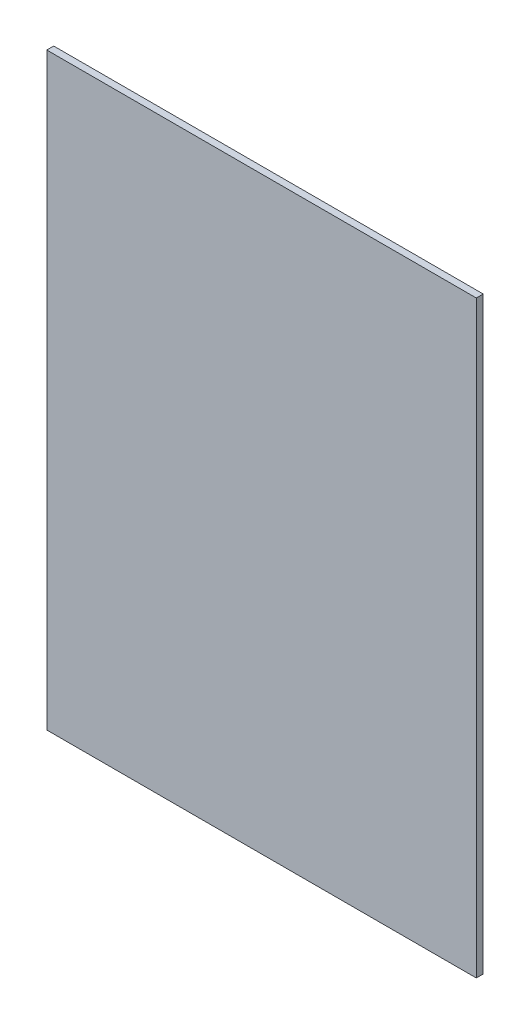
ISO-10303-21;
HEADER;
FILE_DESCRIPTION(('STEP AP214'),'2;1');
FILE_NAME('part.step','',(''),(''),'','','');
FILE_SCHEMA(('AUTOMOTIVE_DESIGN { 1 0 10303 214 1 1 1 1 }'));
ENDSEC;
DATA;
#1=APPLICATION_CONTEXT('core data for automotive mechanical design processes');
#2=APPLICATION_PROTOCOL_DEFINITION('international standard','automotive_design',2000,#1);
#3=PRODUCT_CONTEXT('',#1,'mechanical');
#4=PRODUCT('Part','Part','',(#3));
#5=PRODUCT_RELATED_PRODUCT_CATEGORY('part','',(#4));
#6=PRODUCT_DEFINITION_FORMATION('','',#4);
#7=PRODUCT_DEFINITION_CONTEXT('part definition',#1,'design');
#8=PRODUCT_DEFINITION('design','',#6,#7);
#9=PRODUCT_DEFINITION_SHAPE('','',#8);
#10=(LENGTH_UNIT() NAMED_UNIT(*) SI_UNIT(.MILLI.,.METRE.));
#11=(NAMED_UNIT(*) PLANE_ANGLE_UNIT() SI_UNIT($,.RADIAN.));
#12=(NAMED_UNIT(*) SI_UNIT($,.STERADIAN.) SOLID_ANGLE_UNIT());
#13=UNCERTAINTY_MEASURE_WITH_UNIT(LENGTH_MEASURE(1.E-05),#10,'distance_accuracy_value','');
#14=(GEOMETRIC_REPRESENTATION_CONTEXT(3) GLOBAL_UNCERTAINTY_ASSIGNED_CONTEXT((#13)) GLOBAL_UNIT_ASSIGNED_CONTEXT((#10,
#11,#12)) REPRESENTATION_CONTEXT('',''));
#15=CARTESIAN_POINT('',(0.,0.,0.));
#16=DIRECTION('',(0.,0.,1.));
#17=DIRECTION('',(1.,0.,0.));
#18=AXIS2_PLACEMENT_3D('',#15,#16,#17);
#19=CARTESIAN_POINT('',(-155.,-212.5,5.));
#20=DIRECTION('',(1.,0.,0.));
#21=DIRECTION('',(0.,0.,-1.));
#22=AXIS2_PLACEMENT_3D('',#19,#20,#21);
#23=PLANE('',#22);
#24=DIRECTION('',(0.,-1.,0.));
#25=VECTOR('',#24,1.);
#26=CARTESIAN_POINT('',(-155.,-212.5,0.));
#27=LINE('',#26,#25);
#28=CARTESIAN_POINT('',(-155.,212.5,0.));
#29=VERTEX_POINT('',#28);
#30=CARTESIAN_POINT('',(-155.,-212.5,0.));
#31=VERTEX_POINT('',#30);
#32=EDGE_CURVE('E96',#29,#31,#27,.T.);
#33=ORIENTED_EDGE('',*,*,#32,.T.);
#34=DIRECTION('',(0.,0.,-1.));
#35=VECTOR('',#34,1.);
#36=CARTESIAN_POINT('',(-155.,-212.5,5.));
#37=LINE('',#36,#35);
#38=CARTESIAN_POINT('',(-155.,-212.5,5.));
#39=VERTEX_POINT('',#38);
#40=EDGE_CURVE('E11',#39,#31,#37,.T.);
#41=ORIENTED_EDGE('',*,*,#40,.F.);
#42=DIRECTION('',(0.,-1.,0.));
#43=VECTOR('',#42,1.);
#44=CARTESIAN_POINT('',(-155.,-212.5,5.));
#45=LINE('',#44,#43);
#46=CARTESIAN_POINT('',(-155.,212.5,5.));
#47=VERTEX_POINT('',#46);
#48=EDGE_CURVE('E84',#47,#39,#45,.T.);
#49=ORIENTED_EDGE('',*,*,#48,.F.);
#50=DIRECTION('',(0.,0.,-1.));
#51=VECTOR('',#50,1.);
#52=CARTESIAN_POINT('',(-155.,212.5,5.));
#53=LINE('',#52,#51);
#54=EDGE_CURVE('E92',#47,#29,#53,.T.);
#55=ORIENTED_EDGE('',*,*,#54,.T.);
#56=EDGE_LOOP('',(#33,#41,#49,#55));
#57=FACE_BOUND('',#56,.T.);
#58=ADVANCED_FACE('F33',(#57),#23,.F.);
#59=CARTESIAN_POINT('',(155.,-212.5,5.));
#60=DIRECTION('',(0.,1.,0.));
#61=DIRECTION('',(-1.,0.,0.));
#62=AXIS2_PLACEMENT_3D('',#59,#60,#61);
#63=PLANE('',#62);
#64=DIRECTION('',(1.,0.,0.));
#65=VECTOR('',#64,1.);
#66=CARTESIAN_POINT('',(155.,-212.5,0.));
#67=LINE('',#66,#65);
#68=CARTESIAN_POINT('',(155.,-212.5,0.));
#69=VERTEX_POINT('',#68);
#70=EDGE_CURVE('E88',#31,#69,#67,.T.);
#71=ORIENTED_EDGE('',*,*,#70,.T.);
#72=DIRECTION('',(0.,0.,-1.));
#73=VECTOR('',#72,1.);
#74=CARTESIAN_POINT('',(155.,-212.5,5.));
#75=LINE('',#74,#73);
#76=CARTESIAN_POINT('',(155.,-212.5,5.));
#77=VERTEX_POINT('',#76);
#78=EDGE_CURVE('E41',#77,#69,#75,.T.);
#79=ORIENTED_EDGE('',*,*,#78,.F.);
#80=DIRECTION('',(1.,0.,0.));
#81=VECTOR('',#80,1.);
#82=CARTESIAN_POINT('',(155.,-212.5,5.));
#83=LINE('',#82,#81);
#84=EDGE_CURVE('E79',#39,#77,#83,.T.);
#85=ORIENTED_EDGE('',*,*,#84,.F.);
#86=ORIENTED_EDGE('',*,*,#40,.T.);
#87=EDGE_LOOP('',(#71,#79,#85,#86));
#88=FACE_BOUND('',#87,.T.);
#89=ADVANCED_FACE('F87',(#88),#63,.F.);
#90=CARTESIAN_POINT('',(155.,-212.5,5.));
#91=DIRECTION('',(-1.,0.,0.));
#92=DIRECTION('',(0.,0.,1.));
#93=AXIS2_PLACEMENT_3D('',#90,#91,#92);
#94=PLANE('',#93);
#95=DIRECTION('',(0.,1.,0.));
#96=VECTOR('',#95,1.);
#97=CARTESIAN_POINT('',(155.,-212.5,0.));
#98=LINE('',#97,#96);
#99=CARTESIAN_POINT('',(155.,212.5,0.));
#100=VERTEX_POINT('',#99);
#101=EDGE_CURVE('E66',#69,#100,#98,.T.);
#102=ORIENTED_EDGE('',*,*,#101,.T.);
#103=DIRECTION('',(0.,0.,-1.));
#104=VECTOR('',#103,1.);
#105=CARTESIAN_POINT('',(155.,212.5,5.));
#106=LINE('',#105,#104);
#107=CARTESIAN_POINT('',(155.,212.5,5.));
#108=VERTEX_POINT('',#107);
#109=EDGE_CURVE('E89',#108,#100,#106,.T.);
#110=ORIENTED_EDGE('',*,*,#109,.F.);
#111=DIRECTION('',(0.,1.,0.));
#112=VECTOR('',#111,1.);
#113=CARTESIAN_POINT('',(155.,-212.5,5.));
#114=LINE('',#113,#112);
#115=EDGE_CURVE('E82',#77,#108,#114,.T.);
#116=ORIENTED_EDGE('',*,*,#115,.F.);
#117=ORIENTED_EDGE('',*,*,#78,.T.);
#118=EDGE_LOOP('',(#102,#110,#116,#117));
#119=FACE_BOUND('',#118,.T.);
#120=ADVANCED_FACE('F90',(#119),#94,.F.);
#121=CARTESIAN_POINT('',(155.,212.5,5.));
#122=DIRECTION('',(0.,-1.,0.));
#123=DIRECTION('',(1.,0.,0.));
#124=AXIS2_PLACEMENT_3D('',#121,#122,#123);
#125=PLANE('',#124);
#126=DIRECTION('',(-1.,0.,0.));
#127=VECTOR('',#126,1.);
#128=CARTESIAN_POINT('',(155.,212.5,0.));
#129=LINE('',#128,#127);
#130=EDGE_CURVE('E72',#100,#29,#129,.T.);
#131=ORIENTED_EDGE('',*,*,#130,.T.);
#132=ORIENTED_EDGE('',*,*,#54,.F.);
#133=DIRECTION('',(-1.,0.,0.));
#134=VECTOR('',#133,1.);
#135=CARTESIAN_POINT('',(155.,212.5,5.));
#136=LINE('',#135,#134);
#137=EDGE_CURVE('E49',#108,#47,#136,.T.);
#138=ORIENTED_EDGE('',*,*,#137,.F.);
#139=ORIENTED_EDGE('',*,*,#109,.T.);
#140=EDGE_LOOP('',(#131,#132,#138,#139));
#141=FACE_BOUND('',#140,.T.);
#142=ADVANCED_FACE('F103',(#141),#125,.F.);
#143=CARTESIAN_POINT('',(0.,0.,5.));
#144=DIRECTION('',(0.,0.,1.));
#145=DIRECTION('',(1.,0.,0.));
#146=AXIS2_PLACEMENT_3D('',#143,#144,#145);
#147=PLANE('',#146);
#148=ORIENTED_EDGE('',*,*,#48,.T.);
#149=ORIENTED_EDGE('',*,*,#84,.T.);
#150=ORIENTED_EDGE('',*,*,#115,.T.);
#151=ORIENTED_EDGE('',*,*,#137,.T.);
#152=EDGE_LOOP('',(#148,#149,#150,#151));
#153=FACE_BOUND('',#152,.T.);
#154=ADVANCED_FACE('F80',(#153),#147,.T.);
#155=CARTESIAN_POINT('',(0.,0.,0.));
#156=DIRECTION('',(0.,0.,1.));
#157=DIRECTION('',(1.,0.,0.));
#158=AXIS2_PLACEMENT_3D('',#155,#156,#157);
#159=PLANE('',#158);
#160=ORIENTED_EDGE('',*,*,#32,.F.);
#161=ORIENTED_EDGE('',*,*,#130,.F.);
#162=ORIENTED_EDGE('',*,*,#101,.F.);
#163=ORIENTED_EDGE('',*,*,#70,.F.);
#164=EDGE_LOOP('',(#160,#161,#162,#163));
#165=FACE_BOUND('',#164,.T.);
#166=ADVANCED_FACE('F106',(#165),#159,.F.);
#167=CLOSED_SHELL('',(#58,#89,#120,#142,#154,#166));
#168=MANIFOLD_SOLID_BREP('B2',#167);
#169=ADVANCED_BREP_SHAPE_REPRESENTATION('',(#18,#168),#14);
#170=SHAPE_DEFINITION_REPRESENTATION(#9,#169);
ENDSEC;
END-ISO-10303-21;
